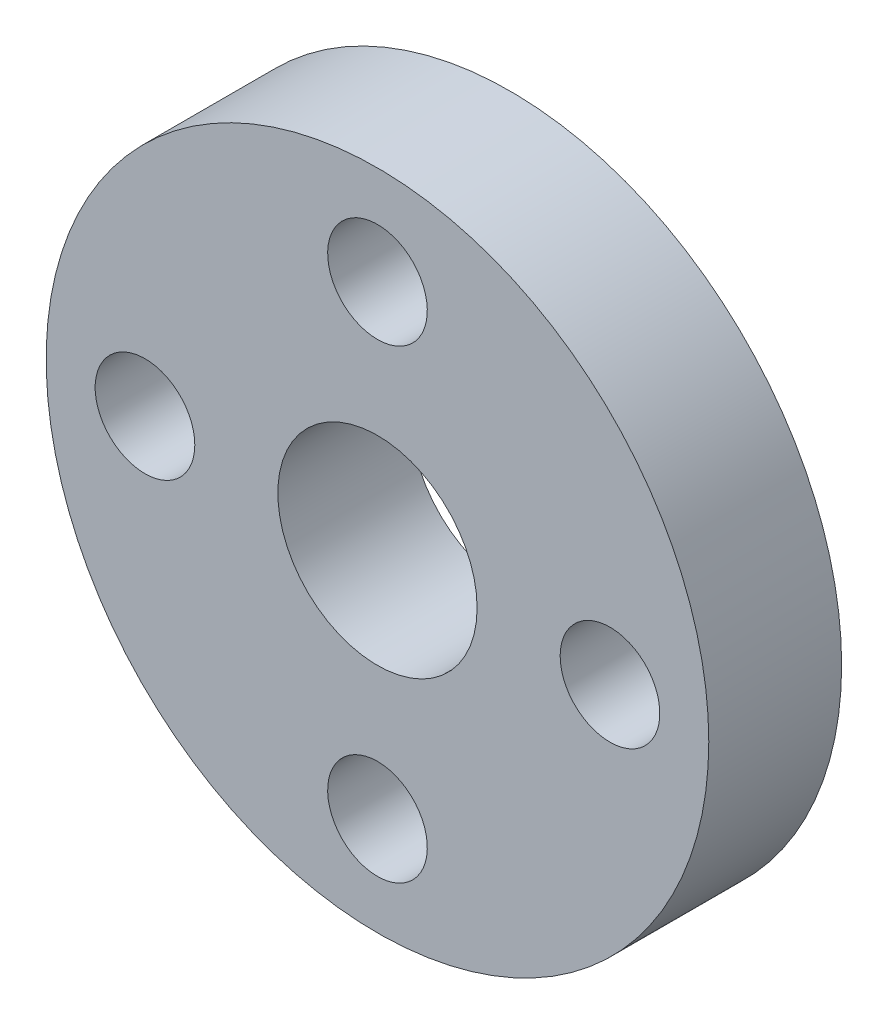
ISO-10303-21;
HEADER;
FILE_DESCRIPTION(('STEP AP214'),'2;1');
FILE_NAME('part.step','',(''),(''),'','','');
FILE_SCHEMA(('AUTOMOTIVE_DESIGN { 1 0 10303 214 1 1 1 1 }'));
ENDSEC;
DATA;
#1=APPLICATION_CONTEXT('core data for automotive mechanical design processes');
#2=APPLICATION_PROTOCOL_DEFINITION('international standard','automotive_design',2000,#1);
#3=PRODUCT_CONTEXT('',#1,'mechanical');
#4=PRODUCT('Part','Part','',(#3));
#5=PRODUCT_RELATED_PRODUCT_CATEGORY('part','',(#4));
#6=PRODUCT_DEFINITION_FORMATION('','',#4);
#7=PRODUCT_DEFINITION_CONTEXT('part definition',#1,'design');
#8=PRODUCT_DEFINITION('design','',#6,#7);
#9=PRODUCT_DEFINITION_SHAPE('','',#8);
#10=(LENGTH_UNIT() NAMED_UNIT(*) SI_UNIT(.MILLI.,.METRE.));
#11=(NAMED_UNIT(*) PLANE_ANGLE_UNIT() SI_UNIT($,.RADIAN.));
#12=(NAMED_UNIT(*) SI_UNIT($,.STERADIAN.) SOLID_ANGLE_UNIT());
#13=UNCERTAINTY_MEASURE_WITH_UNIT(LENGTH_MEASURE(1.E-05),#10,'distance_accuracy_value','');
#14=(GEOMETRIC_REPRESENTATION_CONTEXT(3) GLOBAL_UNCERTAINTY_ASSIGNED_CONTEXT((#13)) GLOBAL_UNIT_ASSIGNED_CONTEXT((#10,
#11,#12)) REPRESENTATION_CONTEXT('',''));
#15=CARTESIAN_POINT('',(0.,0.,0.));
#16=DIRECTION('',(0.,0.,1.));
#17=DIRECTION('',(1.,0.,0.));
#18=AXIS2_PLACEMENT_3D('',#15,#16,#17);
#19=CARTESIAN_POINT('',(0.,0.,4.));
#20=DIRECTION('',(0.,0.,-1.));
#21=DIRECTION('',(-1.,0.,0.));
#22=AXIS2_PLACEMENT_3D('',#19,#20,#21);
#23=CYLINDRICAL_SURFACE('',#22,9.975);
#24=CARTESIAN_POINT('',(0.,0.,4.));
#25=DIRECTION('',(0.,0.,1.));
#26=DIRECTION('',(1.,0.,0.));
#27=AXIS2_PLACEMENT_3D('',#24,#25,#26);
#28=CIRCLE('',#27,9.975);
#29=CARTESIAN_POINT('',(9.975,0.,4.));
#30=VERTEX_POINT('',#29);
#31=EDGE_CURVE('E10',#30,#30,#28,.T.);
#32=ORIENTED_EDGE('',*,*,#31,.F.);
#33=EDGE_LOOP('',(#32));
#34=FACE_BOUND('',#33,.T.);
#35=CARTESIAN_POINT('',(0.,0.,0.));
#36=DIRECTION('',(0.,0.,1.));
#37=DIRECTION('',(1.,0.,0.));
#38=AXIS2_PLACEMENT_3D('',#35,#36,#37);
#39=CIRCLE('',#38,9.975);
#40=CARTESIAN_POINT('',(9.975,0.,0.));
#41=VERTEX_POINT('',#40);
#42=EDGE_CURVE('E40',#41,#41,#39,.T.);
#43=ORIENTED_EDGE('',*,*,#42,.T.);
#44=EDGE_LOOP('',(#43));
#45=FACE_BOUND('',#44,.T.);
#46=ADVANCED_FACE('F37',(#34,#45),#23,.T.);
#47=CARTESIAN_POINT('',(0.,0.,4.));
#48=DIRECTION('',(0.,0.,1.));
#49=DIRECTION('',(1.,0.,0.));
#50=AXIS2_PLACEMENT_3D('',#47,#48,#49);
#51=PLANE('',#50);
#52=CARTESIAN_POINT('',(0.,0.,4.));
#53=DIRECTION('',(0.,0.,1.));
#54=DIRECTION('',(1.,0.,0.));
#55=AXIS2_PLACEMENT_3D('',#52,#53,#54);
#56=CIRCLE('',#55,3.);
#57=CARTESIAN_POINT('',(3.,0.,4.));
#58=VERTEX_POINT('',#57);
#59=EDGE_CURVE('E83',#58,#58,#56,.T.);
#60=ORIENTED_EDGE('',*,*,#59,.F.);
#61=EDGE_LOOP('',(#60));
#62=FACE_BOUND('',#61,.T.);
#63=CARTESIAN_POINT('',(0.,-7.,4.));
#64=DIRECTION('',(0.,0.,1.));
#65=DIRECTION('',(0.,1.,0.));
#66=AXIS2_PLACEMENT_3D('',#63,#64,#65);
#67=CIRCLE('',#66,1.5);
#68=CARTESIAN_POINT('',(0.,-5.5,4.));
#69=VERTEX_POINT('',#68);
#70=EDGE_CURVE('E76',#69,#69,#67,.T.);
#71=ORIENTED_EDGE('',*,*,#70,.F.);
#72=EDGE_LOOP('',(#71));
#73=FACE_BOUND('',#72,.T.);
#74=CARTESIAN_POINT('',(7.,0.,4.));
#75=DIRECTION('',(0.,0.,1.));
#76=DIRECTION('',(-1.,0.,0.));
#77=AXIS2_PLACEMENT_3D('',#74,#75,#76);
#78=CIRCLE('',#77,1.5);
#79=CARTESIAN_POINT('',(5.5,0.,4.));
#80=VERTEX_POINT('',#79);
#81=EDGE_CURVE('E68',#80,#80,#78,.T.);
#82=ORIENTED_EDGE('',*,*,#81,.F.);
#83=EDGE_LOOP('',(#82));
#84=FACE_BOUND('',#83,.T.);
#85=CARTESIAN_POINT('',(0.,7.,4.));
#86=DIRECTION('',(0.,0.,1.));
#87=DIRECTION('',(0.,-1.,0.));
#88=AXIS2_PLACEMENT_3D('',#85,#86,#87);
#89=CIRCLE('',#88,1.5);
#90=CARTESIAN_POINT('',(0.,5.5,4.));
#91=VERTEX_POINT('',#90);
#92=EDGE_CURVE('E59',#91,#91,#89,.T.);
#93=ORIENTED_EDGE('',*,*,#92,.F.);
#94=EDGE_LOOP('',(#93));
#95=FACE_BOUND('',#94,.T.);
#96=CARTESIAN_POINT('',(-7.,0.,4.));
#97=DIRECTION('',(0.,0.,1.));
#98=DIRECTION('',(1.,0.,0.));
#99=AXIS2_PLACEMENT_3D('',#96,#97,#98);
#100=CIRCLE('',#99,1.5);
#101=CARTESIAN_POINT('',(-5.5,0.,4.));
#102=VERTEX_POINT('',#101);
#103=EDGE_CURVE('E51',#102,#102,#100,.T.);
#104=ORIENTED_EDGE('',*,*,#103,.F.);
#105=EDGE_LOOP('',(#104));
#106=FACE_BOUND('',#105,.T.);
#107=ORIENTED_EDGE('',*,*,#31,.T.);
#108=EDGE_LOOP('',(#107));
#109=FACE_BOUND('',#108,.T.);
#110=ADVANCED_FACE('F101',(#62,#73,#84,#95,#106,#109),#51,.T.);
#111=CARTESIAN_POINT('',(0.,0.,0.));
#112=DIRECTION('',(0.,0.,1.));
#113=DIRECTION('',(1.,0.,0.));
#114=AXIS2_PLACEMENT_3D('',#111,#112,#113);
#115=PLANE('',#114);
#116=CARTESIAN_POINT('',(0.,0.,0.));
#117=DIRECTION('',(0.,0.,1.));
#118=DIRECTION('',(1.,0.,0.));
#119=AXIS2_PLACEMENT_3D('',#116,#117,#118);
#120=CIRCLE('',#119,3.);
#121=CARTESIAN_POINT('',(3.,0.,0.));
#122=VERTEX_POINT('',#121);
#123=EDGE_CURVE('E64',#122,#122,#120,.T.);
#124=ORIENTED_EDGE('',*,*,#123,.T.);
#125=EDGE_LOOP('',(#124));
#126=FACE_BOUND('',#125,.T.);
#127=CARTESIAN_POINT('',(0.,-7.,0.));
#128=DIRECTION('',(0.,0.,1.));
#129=DIRECTION('',(0.,1.,0.));
#130=AXIS2_PLACEMENT_3D('',#127,#128,#129);
#131=CIRCLE('',#130,1.5);
#132=CARTESIAN_POINT('',(0.,-5.5,0.));
#133=VERTEX_POINT('',#132);
#134=EDGE_CURVE('E55',#133,#133,#131,.T.);
#135=ORIENTED_EDGE('',*,*,#134,.T.);
#136=EDGE_LOOP('',(#135));
#137=FACE_BOUND('',#136,.T.);
#138=CARTESIAN_POINT('',(7.,0.,0.));
#139=DIRECTION('',(0.,0.,1.));
#140=DIRECTION('',(-1.,0.,0.));
#141=AXIS2_PLACEMENT_3D('',#138,#139,#140);
#142=CIRCLE('',#141,1.5);
#143=CARTESIAN_POINT('',(5.5,0.,0.));
#144=VERTEX_POINT('',#143);
#145=EDGE_CURVE('E72',#144,#144,#142,.T.);
#146=ORIENTED_EDGE('',*,*,#145,.T.);
#147=EDGE_LOOP('',(#146));
#148=FACE_BOUND('',#147,.T.);
#149=CARTESIAN_POINT('',(0.,7.,0.));
#150=DIRECTION('',(0.,0.,1.));
#151=DIRECTION('',(0.,-1.,0.));
#152=AXIS2_PLACEMENT_3D('',#149,#150,#151);
#153=CIRCLE('',#152,1.5);
#154=CARTESIAN_POINT('',(0.,5.5,0.));
#155=VERTEX_POINT('',#154);
#156=EDGE_CURVE('E63',#155,#155,#153,.T.);
#157=ORIENTED_EDGE('',*,*,#156,.T.);
#158=EDGE_LOOP('',(#157));
#159=FACE_BOUND('',#158,.T.);
#160=CARTESIAN_POINT('',(-7.,0.,0.));
#161=DIRECTION('',(0.,0.,1.));
#162=DIRECTION('',(1.,0.,0.));
#163=AXIS2_PLACEMENT_3D('',#160,#161,#162);
#164=CIRCLE('',#163,1.5);
#165=CARTESIAN_POINT('',(-5.5,0.,0.));
#166=VERTEX_POINT('',#165);
#167=EDGE_CURVE('E49',#166,#166,#164,.T.);
#168=ORIENTED_EDGE('',*,*,#167,.T.);
#169=EDGE_LOOP('',(#168));
#170=FACE_BOUND('',#169,.T.);
#171=ORIENTED_EDGE('',*,*,#42,.F.);
#172=EDGE_LOOP('',(#171));
#173=FACE_BOUND('',#172,.T.);
#174=ADVANCED_FACE('F91',(#126,#137,#148,#159,#170,#173),#115,.F.);
#175=CARTESIAN_POINT('',(-7.,0.,0.));
#176=DIRECTION('',(0.,0.,1.));
#177=DIRECTION('',(1.,0.,0.));
#178=AXIS2_PLACEMENT_3D('',#175,#176,#177);
#179=CYLINDRICAL_SURFACE('',#178,1.5);
#180=ORIENTED_EDGE('',*,*,#167,.F.);
#181=EDGE_LOOP('',(#180));
#182=FACE_BOUND('',#181,.T.);
#183=ORIENTED_EDGE('',*,*,#103,.T.);
#184=EDGE_LOOP('',(#183));
#185=FACE_BOUND('',#184,.T.);
#186=ADVANCED_FACE('F113',(#182,#185),#179,.F.);
#187=CARTESIAN_POINT('',(0.,7.,0.));
#188=DIRECTION('',(0.,0.,1.));
#189=DIRECTION('',(1.,0.,0.));
#190=AXIS2_PLACEMENT_3D('',#187,#188,#189);
#191=CYLINDRICAL_SURFACE('',#190,1.5);
#192=ORIENTED_EDGE('',*,*,#156,.F.);
#193=EDGE_LOOP('',(#192));
#194=FACE_BOUND('',#193,.T.);
#195=ORIENTED_EDGE('',*,*,#92,.T.);
#196=EDGE_LOOP('',(#195));
#197=FACE_BOUND('',#196,.T.);
#198=ADVANCED_FACE('F115',(#194,#197),#191,.F.);
#199=CARTESIAN_POINT('',(7.,0.,0.));
#200=DIRECTION('',(0.,0.,1.));
#201=DIRECTION('',(1.,0.,0.));
#202=AXIS2_PLACEMENT_3D('',#199,#200,#201);
#203=CYLINDRICAL_SURFACE('',#202,1.5);
#204=ORIENTED_EDGE('',*,*,#145,.F.);
#205=EDGE_LOOP('',(#204));
#206=FACE_BOUND('',#205,.T.);
#207=ORIENTED_EDGE('',*,*,#81,.T.);
#208=EDGE_LOOP('',(#207));
#209=FACE_BOUND('',#208,.T.);
#210=ADVANCED_FACE('F122',(#206,#209),#203,.F.);
#211=CARTESIAN_POINT('',(0.,-7.,0.));
#212=DIRECTION('',(0.,0.,1.));
#213=DIRECTION('',(1.,0.,0.));
#214=AXIS2_PLACEMENT_3D('',#211,#212,#213);
#215=CYLINDRICAL_SURFACE('',#214,1.5);
#216=ORIENTED_EDGE('',*,*,#134,.F.);
#217=EDGE_LOOP('',(#216));
#218=FACE_BOUND('',#217,.T.);
#219=ORIENTED_EDGE('',*,*,#70,.T.);
#220=EDGE_LOOP('',(#219));
#221=FACE_BOUND('',#220,.T.);
#222=ADVANCED_FACE('F97',(#218,#221),#215,.F.);
#223=CARTESIAN_POINT('',(0.,0.,0.));
#224=DIRECTION('',(0.,0.,1.));
#225=DIRECTION('',(1.,0.,0.));
#226=AXIS2_PLACEMENT_3D('',#223,#224,#225);
#227=CYLINDRICAL_SURFACE('',#226,3.);
#228=ORIENTED_EDGE('',*,*,#123,.F.);
#229=EDGE_LOOP('',(#228));
#230=FACE_BOUND('',#229,.T.);
#231=ORIENTED_EDGE('',*,*,#59,.T.);
#232=EDGE_LOOP('',(#231));
#233=FACE_BOUND('',#232,.T.);
#234=ADVANCED_FACE('F94',(#230,#233),#227,.F.);
#235=CLOSED_SHELL('',(#46,#110,#174,#186,#198,#210,#222,#234));
#236=MANIFOLD_SOLID_BREP('B2',#235);
#237=ADVANCED_BREP_SHAPE_REPRESENTATION('',(#18,#236),#14);
#238=SHAPE_DEFINITION_REPRESENTATION(#9,#237);
ENDSEC;
END-ISO-10303-21;
